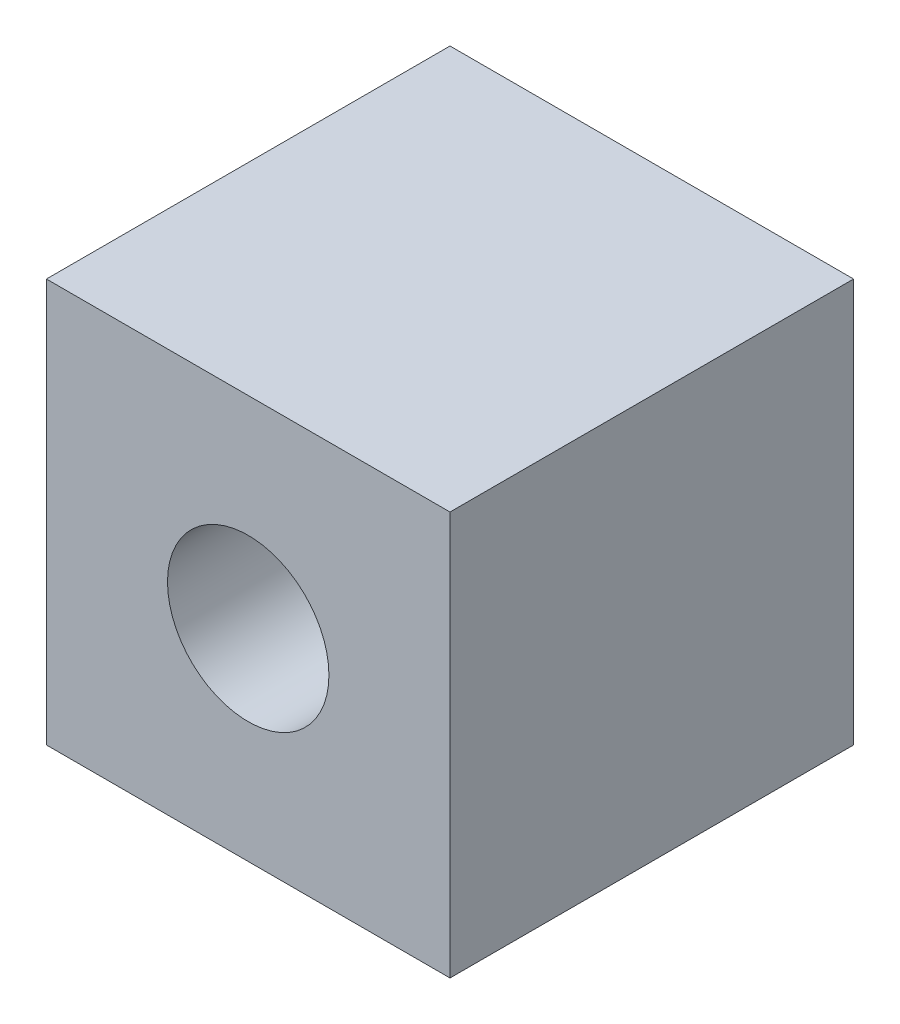
ISO-10303-21;
HEADER;
FILE_DESCRIPTION(('STEP AP214'),'2;1');
FILE_NAME('part.step','',(''),(''),'','','');
FILE_SCHEMA(('AUTOMOTIVE_DESIGN { 1 0 10303 214 1 1 1 1 }'));
ENDSEC;
DATA;
#1=APPLICATION_CONTEXT('core data for automotive mechanical design processes');
#2=APPLICATION_PROTOCOL_DEFINITION('international standard','automotive_design',2000,#1);
#3=PRODUCT_CONTEXT('',#1,'mechanical');
#4=PRODUCT('Part','Part','',(#3));
#5=PRODUCT_RELATED_PRODUCT_CATEGORY('part','',(#4));
#6=PRODUCT_DEFINITION_FORMATION('','',#4);
#7=PRODUCT_DEFINITION_CONTEXT('part definition',#1,'design');
#8=PRODUCT_DEFINITION('design','',#6,#7);
#9=PRODUCT_DEFINITION_SHAPE('','',#8);
#10=(LENGTH_UNIT() NAMED_UNIT(*) SI_UNIT(.MILLI.,.METRE.));
#11=(NAMED_UNIT(*) PLANE_ANGLE_UNIT() SI_UNIT($,.RADIAN.));
#12=(NAMED_UNIT(*) SI_UNIT($,.STERADIAN.) SOLID_ANGLE_UNIT());
#13=UNCERTAINTY_MEASURE_WITH_UNIT(LENGTH_MEASURE(1.E-05),#10,'distance_accuracy_value','');
#14=(GEOMETRIC_REPRESENTATION_CONTEXT(3) GLOBAL_UNCERTAINTY_ASSIGNED_CONTEXT((#13)) GLOBAL_UNIT_ASSIGNED_CONTEXT((#10,
#11,#12)) REPRESENTATION_CONTEXT('',''));
#15=CARTESIAN_POINT('',(0.,0.,0.));
#16=DIRECTION('',(0.,0.,1.));
#17=DIRECTION('',(1.,0.,0.));
#18=AXIS2_PLACEMENT_3D('',#15,#16,#17);
#19=CARTESIAN_POINT('',(0.,10.,10.));
#20=DIRECTION('',(0.,0.,-1.));
#21=DIRECTION('',(-1.,0.,0.));
#22=AXIS2_PLACEMENT_3D('',#19,#20,#21);
#23=PLANE('',#22);
#24=DIRECTION('',(0.,-1.,0.));
#25=VECTOR('',#24,1.);
#26=CARTESIAN_POINT('',(0.,0.,10.));
#27=LINE('',#26,#25);
#28=CARTESIAN_POINT('',(0.,10.,10.));
#29=VERTEX_POINT('',#28);
#30=CARTESIAN_POINT('',(0.,0.,10.));
#31=VERTEX_POINT('',#30);
#32=EDGE_CURVE('E87',#29,#31,#27,.T.);
#33=ORIENTED_EDGE('',*,*,#32,.T.);
#34=DIRECTION('',(1.,0.,0.));
#35=VECTOR('',#34,1.);
#36=CARTESIAN_POINT('',(0.,0.,10.));
#37=LINE('',#36,#35);
#38=CARTESIAN_POINT('',(10.,0.,10.));
#39=VERTEX_POINT('',#38);
#40=EDGE_CURVE('E82',#31,#39,#37,.T.);
#41=ORIENTED_EDGE('',*,*,#40,.T.);
#42=DIRECTION('',(0.,1.,0.));
#43=VECTOR('',#42,1.);
#44=CARTESIAN_POINT('',(10.,0.,10.));
#45=LINE('',#44,#43);
#46=CARTESIAN_POINT('',(10.,10.,10.));
#47=VERTEX_POINT('',#46);
#48=EDGE_CURVE('E85',#39,#47,#45,.T.);
#49=ORIENTED_EDGE('',*,*,#48,.T.);
#50=DIRECTION('',(-1.,0.,0.));
#51=VECTOR('',#50,1.);
#52=CARTESIAN_POINT('',(0.,10.,10.));
#53=LINE('',#52,#51);
#54=EDGE_CURVE('E52',#47,#29,#53,.T.);
#55=ORIENTED_EDGE('',*,*,#54,.T.);
#56=EDGE_LOOP('',(#33,#41,#49,#55));
#57=FACE_BOUND('',#56,.T.);
#58=CARTESIAN_POINT('',(5.,5.,10.));
#59=DIRECTION('',(0.,0.,1.));
#60=DIRECTION('',(1.,0.,0.));
#61=AXIS2_PLACEMENT_3D('',#58,#59,#60);
#62=CIRCLE('',#61,2.);
#63=CARTESIAN_POINT('',(7.,5.,10.));
#64=VERTEX_POINT('',#63);
#65=EDGE_CURVE('E102',#64,#64,#62,.T.);
#66=ORIENTED_EDGE('',*,*,#65,.F.);
#67=EDGE_LOOP('',(#66));
#68=FACE_BOUND('',#67,.T.);
#69=ADVANCED_FACE('F35',(#57,#68),#23,.F.);
#70=CARTESIAN_POINT('',(0.,10.,0.));
#71=DIRECTION('',(0.,0.,-1.));
#72=DIRECTION('',(-1.,0.,0.));
#73=AXIS2_PLACEMENT_3D('',#70,#71,#72);
#74=PLANE('',#73);
#75=DIRECTION('',(0.,-1.,0.));
#76=VECTOR('',#75,1.);
#77=CARTESIAN_POINT('',(0.,0.,0.));
#78=LINE('',#77,#76);
#79=CARTESIAN_POINT('',(0.,10.,0.));
#80=VERTEX_POINT('',#79);
#81=CARTESIAN_POINT('',(0.,0.,0.));
#82=VERTEX_POINT('',#81);
#83=EDGE_CURVE('E99',#80,#82,#78,.T.);
#84=ORIENTED_EDGE('',*,*,#83,.F.);
#85=DIRECTION('',(-1.,0.,0.));
#86=VECTOR('',#85,1.);
#87=CARTESIAN_POINT('',(0.,10.,0.));
#88=LINE('',#87,#86);
#89=CARTESIAN_POINT('',(10.,10.,0.));
#90=VERTEX_POINT('',#89);
#91=EDGE_CURVE('E75',#90,#80,#88,.T.);
#92=ORIENTED_EDGE('',*,*,#91,.F.);
#93=DIRECTION('',(0.,1.,0.));
#94=VECTOR('',#93,1.);
#95=CARTESIAN_POINT('',(10.,0.,0.));
#96=LINE('',#95,#94);
#97=CARTESIAN_POINT('',(10.,0.,0.));
#98=VERTEX_POINT('',#97);
#99=EDGE_CURVE('E69',#98,#90,#96,.T.);
#100=ORIENTED_EDGE('',*,*,#99,.F.);
#101=DIRECTION('',(1.,0.,0.));
#102=VECTOR('',#101,1.);
#103=CARTESIAN_POINT('',(0.,0.,0.));
#104=LINE('',#103,#102);
#105=EDGE_CURVE('E91',#82,#98,#104,.T.);
#106=ORIENTED_EDGE('',*,*,#105,.F.);
#107=EDGE_LOOP('',(#84,#92,#100,#106));
#108=FACE_BOUND('',#107,.T.);
#109=CARTESIAN_POINT('',(5.,5.,0.));
#110=DIRECTION('',(0.,0.,1.));
#111=DIRECTION('',(1.,0.,0.));
#112=AXIS2_PLACEMENT_3D('',#109,#110,#111);
#113=CIRCLE('',#112,2.);
#114=CARTESIAN_POINT('',(7.,5.,0.));
#115=VERTEX_POINT('',#114);
#116=EDGE_CURVE('E114',#115,#115,#113,.T.);
#117=ORIENTED_EDGE('',*,*,#116,.T.);
#118=EDGE_LOOP('',(#117));
#119=FACE_BOUND('',#118,.T.);
#120=ADVANCED_FACE('F110',(#108,#119),#74,.T.);
#121=CARTESIAN_POINT('',(0.,0.,10.));
#122=DIRECTION('',(1.,0.,0.));
#123=DIRECTION('',(0.,0.,-1.));
#124=AXIS2_PLACEMENT_3D('',#121,#122,#123);
#125=PLANE('',#124);
#126=ORIENTED_EDGE('',*,*,#83,.T.);
#127=DIRECTION('',(0.,0.,-1.));
#128=VECTOR('',#127,1.);
#129=CARTESIAN_POINT('',(0.,0.,10.));
#130=LINE('',#129,#128);
#131=EDGE_CURVE('E11',#31,#82,#130,.T.);
#132=ORIENTED_EDGE('',*,*,#131,.F.);
#133=ORIENTED_EDGE('',*,*,#32,.F.);
#134=DIRECTION('',(0.,0.,-1.));
#135=VECTOR('',#134,1.);
#136=CARTESIAN_POINT('',(0.,10.,10.));
#137=LINE('',#136,#135);
#138=EDGE_CURVE('E95',#29,#80,#137,.T.);
#139=ORIENTED_EDGE('',*,*,#138,.T.);
#140=EDGE_LOOP('',(#126,#132,#133,#139));
#141=FACE_BOUND('',#140,.T.);
#142=ADVANCED_FACE('F37',(#141),#125,.F.);
#143=CARTESIAN_POINT('',(0.,0.,10.));
#144=DIRECTION('',(0.,1.,0.));
#145=DIRECTION('',(0.,0.,1.));
#146=AXIS2_PLACEMENT_3D('',#143,#144,#145);
#147=PLANE('',#146);
#148=ORIENTED_EDGE('',*,*,#105,.T.);
#149=DIRECTION('',(0.,0.,-1.));
#150=VECTOR('',#149,1.);
#151=CARTESIAN_POINT('',(10.,0.,10.));
#152=LINE('',#151,#150);
#153=EDGE_CURVE('E44',#39,#98,#152,.T.);
#154=ORIENTED_EDGE('',*,*,#153,.F.);
#155=ORIENTED_EDGE('',*,*,#40,.F.);
#156=ORIENTED_EDGE('',*,*,#131,.T.);
#157=EDGE_LOOP('',(#148,#154,#155,#156));
#158=FACE_BOUND('',#157,.T.);
#159=ADVANCED_FACE('F90',(#158),#147,.F.);
#160=CARTESIAN_POINT('',(10.,0.,10.));
#161=DIRECTION('',(-1.,0.,0.));
#162=DIRECTION('',(0.,0.,1.));
#163=AXIS2_PLACEMENT_3D('',#160,#161,#162);
#164=PLANE('',#163);
#165=ORIENTED_EDGE('',*,*,#99,.T.);
#166=DIRECTION('',(0.,0.,-1.));
#167=VECTOR('',#166,1.);
#168=CARTESIAN_POINT('',(10.,10.,10.));
#169=LINE('',#168,#167);
#170=EDGE_CURVE('E92',#47,#90,#169,.T.);
#171=ORIENTED_EDGE('',*,*,#170,.F.);
#172=ORIENTED_EDGE('',*,*,#48,.F.);
#173=ORIENTED_EDGE('',*,*,#153,.T.);
#174=EDGE_LOOP('',(#165,#171,#172,#173));
#175=FACE_BOUND('',#174,.T.);
#176=ADVANCED_FACE('F93',(#175),#164,.F.);
#177=CARTESIAN_POINT('',(0.,10.,10.));
#178=DIRECTION('',(0.,-1.,0.));
#179=DIRECTION('',(0.,0.,-1.));
#180=AXIS2_PLACEMENT_3D('',#177,#178,#179);
#181=PLANE('',#180);
#182=ORIENTED_EDGE('',*,*,#91,.T.);
#183=ORIENTED_EDGE('',*,*,#138,.F.);
#184=ORIENTED_EDGE('',*,*,#54,.F.);
#185=ORIENTED_EDGE('',*,*,#170,.T.);
#186=EDGE_LOOP('',(#182,#183,#184,#185));
#187=FACE_BOUND('',#186,.T.);
#188=ADVANCED_FACE('F107',(#187),#181,.F.);
#189=CARTESIAN_POINT('',(5.,5.,10.));
#190=DIRECTION('',(0.,0.,-1.));
#191=DIRECTION('',(-1.,0.,0.));
#192=AXIS2_PLACEMENT_3D('',#189,#190,#191);
#193=CYLINDRICAL_SURFACE('',#192,2.);
#194=ORIENTED_EDGE('',*,*,#65,.T.);
#195=EDGE_LOOP('',(#194));
#196=FACE_BOUND('',#195,.T.);
#197=ORIENTED_EDGE('',*,*,#116,.F.);
#198=EDGE_LOOP('',(#197));
#199=FACE_BOUND('',#198,.T.);
#200=ADVANCED_FACE('F120',(#196,#199),#193,.F.);
#201=CLOSED_SHELL('',(#69,#120,#142,#159,#176,#188,#200));
#202=MANIFOLD_SOLID_BREP('B2',#201);
#203=ADVANCED_BREP_SHAPE_REPRESENTATION('',(#18,#202),#14);
#204=SHAPE_DEFINITION_REPRESENTATION(#9,#203);
ENDSEC;
END-ISO-10303-21;
